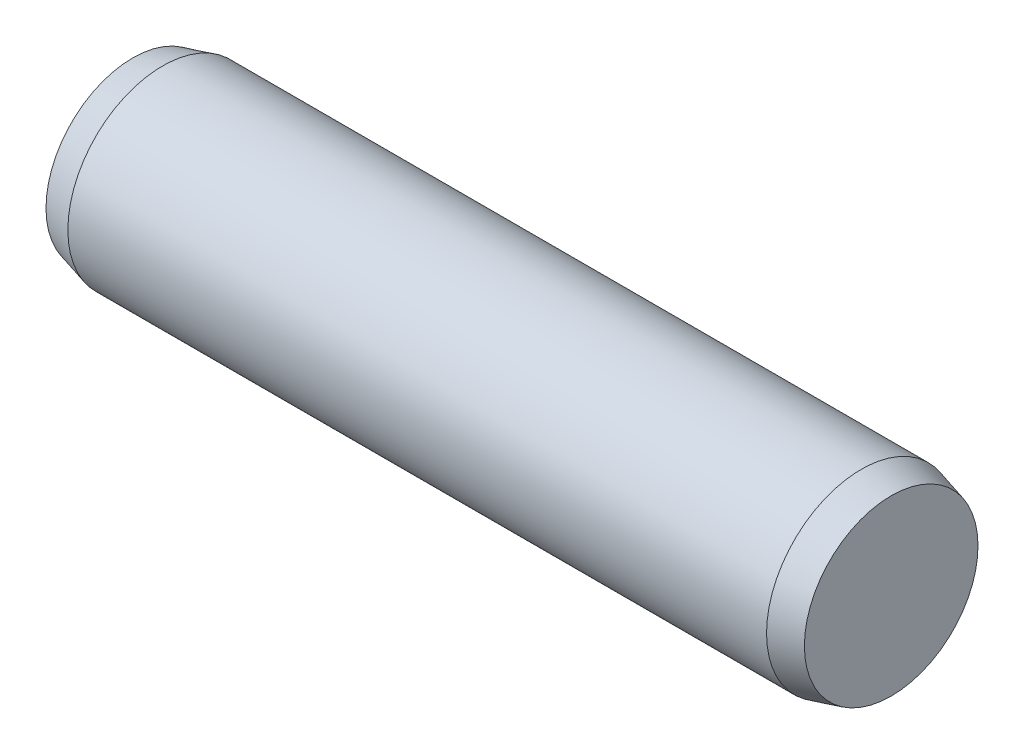
ISO-10303-21;
HEADER;
FILE_DESCRIPTION(('STEP AP214'),'2;1');
FILE_NAME('part.step','',(''),(''),'','','');
FILE_SCHEMA(('AUTOMOTIVE_DESIGN { 1 0 10303 214 1 1 1 1 }'));
ENDSEC;
DATA;
#1=APPLICATION_CONTEXT('core data for automotive mechanical design processes');
#2=APPLICATION_PROTOCOL_DEFINITION('international standard','automotive_design',2000,#1);
#3=PRODUCT_CONTEXT('',#1,'mechanical');
#4=PRODUCT('Part','Part','',(#3));
#5=PRODUCT_RELATED_PRODUCT_CATEGORY('part','',(#4));
#6=PRODUCT_DEFINITION_FORMATION('','',#4);
#7=PRODUCT_DEFINITION_CONTEXT('part definition',#1,'design');
#8=PRODUCT_DEFINITION('design','',#6,#7);
#9=PRODUCT_DEFINITION_SHAPE('','',#8);
#10=(LENGTH_UNIT() NAMED_UNIT(*) SI_UNIT(.MILLI.,.METRE.));
#11=(NAMED_UNIT(*) PLANE_ANGLE_UNIT() SI_UNIT($,.RADIAN.));
#12=(NAMED_UNIT(*) SI_UNIT($,.STERADIAN.) SOLID_ANGLE_UNIT());
#13=UNCERTAINTY_MEASURE_WITH_UNIT(LENGTH_MEASURE(1.E-05),#10,'distance_accuracy_value','');
#14=(GEOMETRIC_REPRESENTATION_CONTEXT(3) GLOBAL_UNCERTAINTY_ASSIGNED_CONTEXT((#13)) GLOBAL_UNIT_ASSIGNED_CONTEXT((#10,
#11,#12)) REPRESENTATION_CONTEXT('',''));
#15=CARTESIAN_POINT('',(0.,0.,0.));
#16=DIRECTION('',(0.,0.,1.));
#17=DIRECTION('',(1.,0.,0.));
#18=AXIS2_PLACEMENT_3D('',#15,#16,#17);
#19=CARTESIAN_POINT('',(0.,1.83119200876837,0.));
#20=DIRECTION('',(1.,0.,0.));
#21=DIRECTION('',(0.,0.,-1.));
#22=AXIS2_PLACEMENT_3D('',#19,#20,#21);
#23=PLANE('',#22);
#24=CARTESIAN_POINT('',(0.,0.,0.));
#25=DIRECTION('',(-1.,0.,0.));
#26=DIRECTION('',(0.,0.,1.));
#27=AXIS2_PLACEMENT_3D('',#24,#25,#26);
#28=CIRCLE('',#27,1.83119200876837);
#29=CARTESIAN_POINT('',(0.,0.,1.83119200876837));
#30=VERTEX_POINT('',#29);
#31=EDGE_CURVE('E42',#30,#30,#28,.T.);
#32=ORIENTED_EDGE('',*,*,#31,.T.);
#33=EDGE_LOOP('',(#32));
#34=FACE_BOUND('',#33,.T.);
#35=ADVANCED_FACE('F28',(#34),#23,.F.);
#36=CARTESIAN_POINT('',(16.,0.,0.));
#37=DIRECTION('',(-1.,0.,0.));
#38=DIRECTION('',(0.,0.,1.));
#39=AXIS2_PLACEMENT_3D('',#36,#37,#38);
#40=PLANE('',#39);
#41=CARTESIAN_POINT('',(16.,0.,0.));
#42=DIRECTION('',(-1.,0.,0.));
#43=DIRECTION('',(0.,0.,1.));
#44=AXIS2_PLACEMENT_3D('',#41,#42,#43);
#45=CIRCLE('',#44,1.83119200876837);
#46=CARTESIAN_POINT('',(16.,0.,1.83119200876837));
#47=VERTEX_POINT('',#46);
#48=EDGE_CURVE('E10',#47,#47,#45,.T.);
#49=ORIENTED_EDGE('',*,*,#48,.F.);
#50=EDGE_LOOP('',(#49));
#51=FACE_BOUND('',#50,.T.);
#52=ADVANCED_FACE('F62',(#51),#40,.F.);
#53=CARTESIAN_POINT('',(16.,0.,0.));
#54=DIRECTION('',(-1.,0.,0.));
#55=DIRECTION('',(0.,0.,1.));
#56=AXIS2_PLACEMENT_3D('',#53,#54,#55);
#57=CONICAL_SURFACE('',#56,1.83119200876837,0.26179938779915);
#58=CARTESIAN_POINT('',(15.37,0.,0.));
#59=DIRECTION('',(-1.,0.,0.));
#60=DIRECTION('',(0.,0.,1.));
#61=AXIS2_PLACEMENT_3D('',#58,#59,#60);
#62=CIRCLE('',#61,1.99999999999998);
#63=CARTESIAN_POINT('',(15.37,0.,1.99999999999998));
#64=VERTEX_POINT('',#63);
#65=EDGE_CURVE('E34',#64,#64,#62,.T.);
#66=ORIENTED_EDGE('',*,*,#65,.F.);
#67=EDGE_LOOP('',(#66));
#68=FACE_BOUND('',#67,.T.);
#69=ORIENTED_EDGE('',*,*,#48,.T.);
#70=EDGE_LOOP('',(#69));
#71=FACE_BOUND('',#70,.T.);
#72=ADVANCED_FACE('F57',(#68,#71),#57,.T.);
#73=CARTESIAN_POINT('',(-6.35,0.,0.));
#74=DIRECTION('',(-1.,0.,0.));
#75=DIRECTION('',(0.,0.,1.));
#76=AXIS2_PLACEMENT_3D('',#73,#74,#75);
#77=CYLINDRICAL_SURFACE('',#76,1.99999999999997);
#78=CARTESIAN_POINT('',(0.63,0.,0.));
#79=DIRECTION('',(-1.,0.,0.));
#80=DIRECTION('',(0.,0.,1.));
#81=AXIS2_PLACEMENT_3D('',#78,#79,#80);
#82=CIRCLE('',#81,1.99999999999997);
#83=CARTESIAN_POINT('',(0.63,0.,1.99999999999997));
#84=VERTEX_POINT('',#83);
#85=EDGE_CURVE('E38',#84,#84,#82,.T.);
#86=ORIENTED_EDGE('',*,*,#85,.F.);
#87=EDGE_LOOP('',(#86));
#88=FACE_BOUND('',#87,.T.);
#89=ORIENTED_EDGE('',*,*,#65,.T.);
#90=EDGE_LOOP('',(#89));
#91=FACE_BOUND('',#90,.T.);
#92=ADVANCED_FACE('F52',(#88,#91),#77,.T.);
#93=CARTESIAN_POINT('',(0.63,0.,0.));
#94=DIRECTION('',(1.,0.,0.));
#95=DIRECTION('',(0.,0.,-1.));
#96=AXIS2_PLACEMENT_3D('',#93,#94,#95);
#97=CONICAL_SURFACE('',#96,1.99999999999997,0.261799387799147);
#98=ORIENTED_EDGE('',*,*,#31,.F.);
#99=EDGE_LOOP('',(#98));
#100=FACE_BOUND('',#99,.T.);
#101=ORIENTED_EDGE('',*,*,#85,.T.);
#102=EDGE_LOOP('',(#101));
#103=FACE_BOUND('',#102,.T.);
#104=ADVANCED_FACE('F49',(#100,#103),#97,.T.);
#105=CLOSED_SHELL('',(#35,#52,#72,#92,#104));
#106=MANIFOLD_SOLID_BREP('B2',#105);
#107=ADVANCED_BREP_SHAPE_REPRESENTATION('',(#18,#106),#14);
#108=SHAPE_DEFINITION_REPRESENTATION(#9,#107);
ENDSEC;
END-ISO-10303-21;
